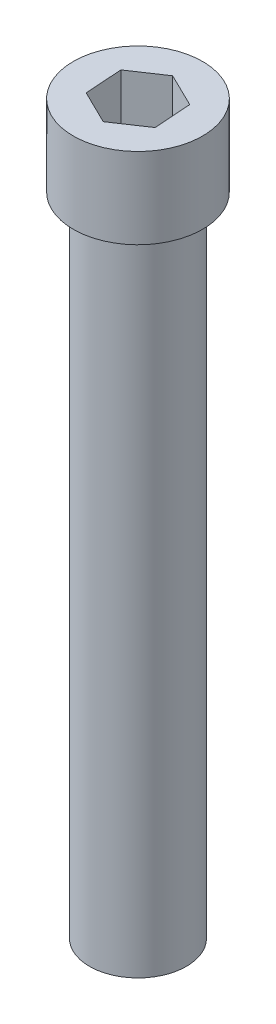
ISO-10303-21;
HEADER;
FILE_DESCRIPTION(('STEP AP214'),'2;1');
FILE_NAME('part.step','',(''),(''),'','','');
FILE_SCHEMA(('AUTOMOTIVE_DESIGN { 1 0 10303 214 1 1 1 1 }'));
ENDSEC;
DATA;
#1=APPLICATION_CONTEXT('core data for automotive mechanical design processes');
#2=APPLICATION_PROTOCOL_DEFINITION('international standard','automotive_design',2000,#1);
#3=PRODUCT_CONTEXT('',#1,'mechanical');
#4=PRODUCT('Part','Part','',(#3));
#5=PRODUCT_RELATED_PRODUCT_CATEGORY('part','',(#4));
#6=PRODUCT_DEFINITION_FORMATION('','',#4);
#7=PRODUCT_DEFINITION_CONTEXT('part definition',#1,'design');
#8=PRODUCT_DEFINITION('design','',#6,#7);
#9=PRODUCT_DEFINITION_SHAPE('','',#8);
#10=(LENGTH_UNIT() NAMED_UNIT(*) SI_UNIT(.MILLI.,.METRE.));
#11=(NAMED_UNIT(*) PLANE_ANGLE_UNIT() SI_UNIT($,.RADIAN.));
#12=(NAMED_UNIT(*) SI_UNIT($,.STERADIAN.) SOLID_ANGLE_UNIT());
#13=UNCERTAINTY_MEASURE_WITH_UNIT(LENGTH_MEASURE(1.E-05),#10,'distance_accuracy_value','');
#14=(GEOMETRIC_REPRESENTATION_CONTEXT(3) GLOBAL_UNCERTAINTY_ASSIGNED_CONTEXT((#13)) GLOBAL_UNIT_ASSIGNED_CONTEXT((#10,
#11,#12)) REPRESENTATION_CONTEXT('',''));
#15=CARTESIAN_POINT('',(0.,0.,0.));
#16=DIRECTION('',(0.,0.,1.));
#17=DIRECTION('',(1.,0.,0.));
#18=AXIS2_PLACEMENT_3D('',#15,#16,#17);
#19=CARTESIAN_POINT('',(-3.,0.,0.));
#20=DIRECTION('',(0.,-1.,0.));
#21=DIRECTION('',(1.,0.,0.));
#22=AXIS2_PLACEMENT_3D('',#19,#20,#21);
#23=PLANE('',#22);
#24=CARTESIAN_POINT('',(0.,0.,0.));
#25=DIRECTION('',(0.,1.,0.));
#26=DIRECTION('',(-1.,0.,0.));
#27=AXIS2_PLACEMENT_3D('',#24,#25,#26);
#28=CIRCLE('',#27,3.);
#29=CARTESIAN_POINT('',(-3.,0.,0.));
#30=VERTEX_POINT('',#29);
#31=EDGE_CURVE('E135',#30,#30,#28,.T.);
#32=ORIENTED_EDGE('',*,*,#31,.T.);
#33=EDGE_LOOP('',(#32));
#34=FACE_BOUND('',#33,.T.);
#35=CARTESIAN_POINT('',(0.,0.,0.));
#36=DIRECTION('',(0.,1.,0.));
#37=DIRECTION('',(-1.,0.,0.));
#38=AXIS2_PLACEMENT_3D('',#35,#36,#37);
#39=CIRCLE('',#38,4.);
#40=CARTESIAN_POINT('',(-4.,0.,0.));
#41=VERTEX_POINT('',#40);
#42=EDGE_CURVE('E11',#41,#41,#39,.T.);
#43=ORIENTED_EDGE('',*,*,#42,.F.);
#44=EDGE_LOOP('',(#43));
#45=FACE_BOUND('',#44,.T.);
#46=ADVANCED_FACE('F34',(#34,#45),#23,.T.);
#47=CARTESIAN_POINT('',(0.,5.,0.));
#48=DIRECTION('',(0.,1.,0.));
#49=DIRECTION('',(-1.,0.,0.));
#50=AXIS2_PLACEMENT_3D('',#47,#48,#49);
#51=CYLINDRICAL_SURFACE('',#50,4.);
#52=ORIENTED_EDGE('',*,*,#42,.T.);
#53=EDGE_LOOP('',(#52));
#54=FACE_BOUND('',#53,.T.);
#55=CARTESIAN_POINT('',(0.,5.,0.));
#56=DIRECTION('',(0.,1.,0.));
#57=DIRECTION('',(-1.,0.,0.));
#58=AXIS2_PLACEMENT_3D('',#55,#56,#57);
#59=CIRCLE('',#58,4.);
#60=CARTESIAN_POINT('',(-4.,5.,0.));
#61=VERTEX_POINT('',#60);
#62=EDGE_CURVE('E41',#61,#61,#59,.T.);
#63=ORIENTED_EDGE('',*,*,#62,.F.);
#64=EDGE_LOOP('',(#63));
#65=FACE_BOUND('',#64,.T.);
#66=ADVANCED_FACE('F150',(#54,#65),#51,.T.);
#67=CARTESIAN_POINT('',(-4.,5.,0.));
#68=DIRECTION('',(0.,1.,0.));
#69=DIRECTION('',(-1.,0.,0.));
#70=AXIS2_PLACEMENT_3D('',#67,#68,#69);
#71=PLANE('',#70);
#72=DIRECTION('',(-0.067893773708489,0.,-0.997692555595971));
#73=VECTOR('',#72,1.);
#74=CARTESIAN_POINT('',(2.07378208824573,5.,1.01624858366666));
#75=LINE('',#74,#73);
#76=CARTESIAN_POINT('',(2.07378208824573,5.,1.01624858366666));
#77=VERTEX_POINT('',#76);
#78=CARTESIAN_POINT('',(1.91698813413815,5.,-1.28782367850062));
#79=VERTEX_POINT('',#78);
#80=EDGE_CURVE('E48',#77,#79,#75,.T.);
#81=ORIENTED_EDGE('',*,*,#80,.F.);
#82=DIRECTION('',(0.830080211458485,0.,-0.557644010588329));
#83=VECTOR('',#82,1.);
#84=CARTESIAN_POINT('',(0.156793954107583,5.,2.30407226216728));
#85=LINE('',#84,#83);
#86=CARTESIAN_POINT('',(0.156793954107583,5.,2.30407226216728));
#87=VERTEX_POINT('',#86);
#88=EDGE_CURVE('E131',#87,#77,#85,.T.);
#89=ORIENTED_EDGE('',*,*,#88,.F.);
#90=DIRECTION('',(0.897973985166974,0.,0.440048545007642));
#91=VECTOR('',#90,1.);
#92=CARTESIAN_POINT('',(-1.91698813413815,5.,1.28782367850062));
#93=LINE('',#92,#91);
#94=CARTESIAN_POINT('',(-1.91698813413815,5.,1.28782367850062));
#95=VERTEX_POINT('',#94);
#96=EDGE_CURVE('E129',#95,#87,#93,.T.);
#97=ORIENTED_EDGE('',*,*,#96,.F.);
#98=DIRECTION('',(0.0678937737084894,0.,0.997692555595971));
#99=VECTOR('',#98,1.);
#100=CARTESIAN_POINT('',(-2.07378208824573,5.,-1.01624858366666));
#101=LINE('',#100,#99);
#102=CARTESIAN_POINT('',(-2.07378208824573,5.,-1.01624858366666));
#103=VERTEX_POINT('',#102);
#104=EDGE_CURVE('E96',#103,#95,#101,.T.);
#105=ORIENTED_EDGE('',*,*,#104,.F.);
#106=DIRECTION('',(-0.830080211458485,0.,0.55764401058833));
#107=VECTOR('',#106,1.);
#108=CARTESIAN_POINT('',(-0.156793954107583,5.,-2.30407226216728));
#109=LINE('',#108,#107);
#110=CARTESIAN_POINT('',(-0.156793954107583,5.,-2.30407226216728));
#111=VERTEX_POINT('',#110);
#112=EDGE_CURVE('E125',#111,#103,#109,.T.);
#113=ORIENTED_EDGE('',*,*,#112,.F.);
#114=DIRECTION('',(-0.897973985166974,0.,-0.440048545007642));
#115=VECTOR('',#114,1.);
#116=CARTESIAN_POINT('',(1.91698813413815,5.,-1.28782367850062));
#117=LINE('',#116,#115);
#118=EDGE_CURVE('E122',#79,#111,#117,.T.);
#119=ORIENTED_EDGE('',*,*,#118,.F.);
#120=EDGE_LOOP('',(#81,#89,#97,#105,#113,#119));
#121=FACE_BOUND('',#120,.T.);
#122=ORIENTED_EDGE('',*,*,#62,.T.);
#123=EDGE_LOOP('',(#122));
#124=FACE_BOUND('',#123,.T.);
#125=ADVANCED_FACE('F148',(#121,#124),#71,.T.);
#126=CARTESIAN_POINT('',(0.,-40.,0.));
#127=DIRECTION('',(0.,-1.,0.));
#128=DIRECTION('',(1.,0.,0.));
#129=AXIS2_PLACEMENT_3D('',#126,#127,#128);
#130=PLANE('',#129);
#131=CARTESIAN_POINT('',(0.,-40.,0.));
#132=DIRECTION('',(0.,1.,0.));
#133=DIRECTION('',(-1.,0.,0.));
#134=AXIS2_PLACEMENT_3D('',#131,#132,#133);
#135=CIRCLE('',#134,3.);
#136=CARTESIAN_POINT('',(-3.,-40.,0.));
#137=VERTEX_POINT('',#136);
#138=EDGE_CURVE('E143',#137,#137,#135,.T.);
#139=ORIENTED_EDGE('',*,*,#138,.F.);
#140=EDGE_LOOP('',(#139));
#141=FACE_BOUND('',#140,.T.);
#142=ADVANCED_FACE('F157',(#141),#130,.T.);
#143=CARTESIAN_POINT('',(0.,5.,0.));
#144=DIRECTION('',(0.,1.,0.));
#145=DIRECTION('',(-1.,0.,0.));
#146=AXIS2_PLACEMENT_3D('',#143,#144,#145);
#147=CYLINDRICAL_SURFACE('',#146,3.);
#148=ORIENTED_EDGE('',*,*,#138,.T.);
#149=EDGE_LOOP('',(#148));
#150=FACE_BOUND('',#149,.T.);
#151=ORIENTED_EDGE('',*,*,#31,.F.);
#152=EDGE_LOOP('',(#151));
#153=FACE_BOUND('',#152,.T.);
#154=ADVANCED_FACE('F164',(#150,#153),#147,.T.);
#155=CARTESIAN_POINT('',(2.07378208824573,1.,1.01624858366666));
#156=DIRECTION('',(0.997692555595971,0.,-0.067893773708489));
#157=DIRECTION('',(-0.067893773708489,0.,-0.997692555595971));
#158=AXIS2_PLACEMENT_3D('',#155,#156,#157);
#159=PLANE('',#158);
#160=ORIENTED_EDGE('',*,*,#80,.T.);
#161=DIRECTION('',(0.,1.,0.));
#162=VECTOR('',#161,1.);
#163=CARTESIAN_POINT('',(1.91698813413815,1.,-1.28782367850062));
#164=LINE('',#163,#162);
#165=CARTESIAN_POINT('',(1.91698813413815,1.,-1.28782367850062));
#166=VERTEX_POINT('',#165);
#167=EDGE_CURVE('E78',#166,#79,#164,.T.);
#168=ORIENTED_EDGE('',*,*,#167,.F.);
#169=DIRECTION('',(-0.067893773708489,0.,-0.997692555595971));
#170=VECTOR('',#169,1.);
#171=CARTESIAN_POINT('',(2.07378208824573,1.,1.01624858366666));
#172=LINE('',#171,#170);
#173=CARTESIAN_POINT('',(2.07378208824573,1.,1.01624858366666));
#174=VERTEX_POINT('',#173);
#175=EDGE_CURVE('E133',#174,#166,#172,.T.);
#176=ORIENTED_EDGE('',*,*,#175,.F.);
#177=DIRECTION('',(0.,1.,0.));
#178=VECTOR('',#177,1.);
#179=CARTESIAN_POINT('',(2.07378208824573,1.,1.01624858366666));
#180=LINE('',#179,#178);
#181=EDGE_CURVE('E56',#174,#77,#180,.T.);
#182=ORIENTED_EDGE('',*,*,#181,.T.);
#183=EDGE_LOOP('',(#160,#168,#176,#182));
#184=FACE_BOUND('',#183,.T.);
#185=ADVANCED_FACE('F168',(#184),#159,.F.);
#186=CARTESIAN_POINT('',(0.156793954107584,1.,2.30407226216728));
#187=DIRECTION('',(0.55764401058833,0.,0.830080211458485));
#188=DIRECTION('',(0.830080211458485,0.,-0.55764401058833));
#189=AXIS2_PLACEMENT_3D('',#186,#187,#188);
#190=PLANE('',#189);
#191=ORIENTED_EDGE('',*,*,#88,.T.);
#192=ORIENTED_EDGE('',*,*,#181,.F.);
#193=DIRECTION('',(0.830080211458485,0.,-0.557644010588329));
#194=VECTOR('',#193,1.);
#195=CARTESIAN_POINT('',(0.156793954107584,1.,2.30407226216728));
#196=LINE('',#195,#194);
#197=CARTESIAN_POINT('',(0.156793954107584,1.,2.30407226216728));
#198=VERTEX_POINT('',#197);
#199=EDGE_CURVE('E108',#198,#174,#196,.T.);
#200=ORIENTED_EDGE('',*,*,#199,.F.);
#201=DIRECTION('',(0.,1.,0.));
#202=VECTOR('',#201,1.);
#203=CARTESIAN_POINT('',(0.156793954107584,1.,2.30407226216728));
#204=LINE('',#203,#202);
#205=EDGE_CURVE('E100',#198,#87,#204,.T.);
#206=ORIENTED_EDGE('',*,*,#205,.T.);
#207=EDGE_LOOP('',(#191,#192,#200,#206));
#208=FACE_BOUND('',#207,.T.);
#209=ADVANCED_FACE('F172',(#208),#190,.F.);
#210=CARTESIAN_POINT('',(-1.91698813413815,1.,1.28782367850062));
#211=DIRECTION('',(-0.440048545007642,0.,0.897973985166974));
#212=DIRECTION('',(0.897973985166974,0.,0.440048545007642));
#213=AXIS2_PLACEMENT_3D('',#210,#211,#212);
#214=PLANE('',#213);
#215=ORIENTED_EDGE('',*,*,#96,.T.);
#216=ORIENTED_EDGE('',*,*,#205,.F.);
#217=DIRECTION('',(0.897973985166974,0.,0.440048545007642));
#218=VECTOR('',#217,1.);
#219=CARTESIAN_POINT('',(-1.91698813413815,1.,1.28782367850062));
#220=LINE('',#219,#218);
#221=CARTESIAN_POINT('',(-1.91698813413815,1.,1.28782367850062));
#222=VERTEX_POINT('',#221);
#223=EDGE_CURVE('E104',#222,#198,#220,.T.);
#224=ORIENTED_EDGE('',*,*,#223,.F.);
#225=DIRECTION('',(0.,1.,0.));
#226=VECTOR('',#225,1.);
#227=CARTESIAN_POINT('',(-1.91698813413815,1.,1.28782367850062));
#228=LINE('',#227,#226);
#229=EDGE_CURVE('E89',#222,#95,#228,.T.);
#230=ORIENTED_EDGE('',*,*,#229,.T.);
#231=EDGE_LOOP('',(#215,#216,#224,#230));
#232=FACE_BOUND('',#231,.T.);
#233=ADVANCED_FACE('F105',(#232),#214,.F.);
#234=CARTESIAN_POINT('',(-2.07378208824573,1.,-1.01624858366666));
#235=DIRECTION('',(-0.997692555595971,0.,0.0678937737084894));
#236=DIRECTION('',(0.0678937737084894,0.,0.997692555595971));
#237=AXIS2_PLACEMENT_3D('',#234,#235,#236);
#238=PLANE('',#237);
#239=ORIENTED_EDGE('',*,*,#104,.T.);
#240=ORIENTED_EDGE('',*,*,#229,.F.);
#241=DIRECTION('',(0.0678937737084894,0.,0.997692555595971));
#242=VECTOR('',#241,1.);
#243=CARTESIAN_POINT('',(-2.07378208824573,1.,-1.01624858366666));
#244=LINE('',#243,#242);
#245=CARTESIAN_POINT('',(-2.07378208824573,1.,-1.01624858366666));
#246=VERTEX_POINT('',#245);
#247=EDGE_CURVE('E93',#246,#222,#244,.T.);
#248=ORIENTED_EDGE('',*,*,#247,.F.);
#249=DIRECTION('',(0.,1.,0.));
#250=VECTOR('',#249,1.);
#251=CARTESIAN_POINT('',(-2.07378208824573,1.,-1.01624858366666));
#252=LINE('',#251,#250);
#253=EDGE_CURVE('E101',#246,#103,#252,.T.);
#254=ORIENTED_EDGE('',*,*,#253,.T.);
#255=EDGE_LOOP('',(#239,#240,#248,#254));
#256=FACE_BOUND('',#255,.T.);
#257=ADVANCED_FACE('F91',(#256),#238,.F.);
#258=CARTESIAN_POINT('',(-0.156793954107582,1.,-2.30407226216728));
#259=DIRECTION('',(-0.55764401058833,0.,-0.830080211458485));
#260=DIRECTION('',(-0.830080211458485,0.,0.55764401058833));
#261=AXIS2_PLACEMENT_3D('',#258,#259,#260);
#262=PLANE('',#261);
#263=ORIENTED_EDGE('',*,*,#112,.T.);
#264=ORIENTED_EDGE('',*,*,#253,.F.);
#265=DIRECTION('',(-0.830080211458485,0.,0.55764401058833));
#266=VECTOR('',#265,1.);
#267=CARTESIAN_POINT('',(-0.156793954107582,1.,-2.30407226216728));
#268=LINE('',#267,#266);
#269=CARTESIAN_POINT('',(-0.156793954107582,1.,-2.30407226216728));
#270=VERTEX_POINT('',#269);
#271=EDGE_CURVE('E114',#270,#246,#268,.T.);
#272=ORIENTED_EDGE('',*,*,#271,.F.);
#273=DIRECTION('',(0.,1.,0.));
#274=VECTOR('',#273,1.);
#275=CARTESIAN_POINT('',(-0.156793954107582,1.,-2.30407226216728));
#276=LINE('',#275,#274);
#277=EDGE_CURVE('E138',#270,#111,#276,.T.);
#278=ORIENTED_EDGE('',*,*,#277,.T.);
#279=EDGE_LOOP('',(#263,#264,#272,#278));
#280=FACE_BOUND('',#279,.T.);
#281=ADVANCED_FACE('F176',(#280),#262,.F.);
#282=CARTESIAN_POINT('',(1.91698813413815,1.,-1.28782367850062));
#283=DIRECTION('',(0.440048545007642,0.,-0.897973985166974));
#284=DIRECTION('',(-0.897973985166974,0.,-0.440048545007642));
#285=AXIS2_PLACEMENT_3D('',#282,#283,#284);
#286=PLANE('',#285);
#287=ORIENTED_EDGE('',*,*,#118,.T.);
#288=ORIENTED_EDGE('',*,*,#277,.F.);
#289=DIRECTION('',(-0.897973985166974,0.,-0.440048545007642));
#290=VECTOR('',#289,1.);
#291=CARTESIAN_POINT('',(1.91698813413815,1.,-1.28782367850062));
#292=LINE('',#291,#290);
#293=EDGE_CURVE('E116',#166,#270,#292,.T.);
#294=ORIENTED_EDGE('',*,*,#293,.F.);
#295=ORIENTED_EDGE('',*,*,#167,.T.);
#296=EDGE_LOOP('',(#287,#288,#294,#295));
#297=FACE_BOUND('',#296,.T.);
#298=ADVANCED_FACE('F173',(#297),#286,.F.);
#299=CARTESIAN_POINT('',(1.91698813413815,1.,-1.28782367850062));
#300=DIRECTION('',(0.,1.,0.));
#301=DIRECTION('',(0.,0.,1.));
#302=AXIS2_PLACEMENT_3D('',#299,#300,#301);
#303=PLANE('',#302);
#304=ORIENTED_EDGE('',*,*,#175,.T.);
#305=ORIENTED_EDGE('',*,*,#293,.T.);
#306=ORIENTED_EDGE('',*,*,#271,.T.);
#307=ORIENTED_EDGE('',*,*,#247,.T.);
#308=ORIENTED_EDGE('',*,*,#223,.T.);
#309=ORIENTED_EDGE('',*,*,#199,.T.);
#310=EDGE_LOOP('',(#304,#305,#306,#307,#308,#309));
#311=FACE_BOUND('',#310,.T.);
#312=ADVANCED_FACE('F111',(#311),#303,.T.);
#313=CLOSED_SHELL('',(#46,#66,#125,#142,#154,#185,#209,#233,#257,#281,#298,#312));
#314=MANIFOLD_SOLID_BREP('B2',#313);
#315=ADVANCED_BREP_SHAPE_REPRESENTATION('',(#18,#314),#14);
#316=SHAPE_DEFINITION_REPRESENTATION(#9,#315);
ENDSEC;
END-ISO-10303-21;
